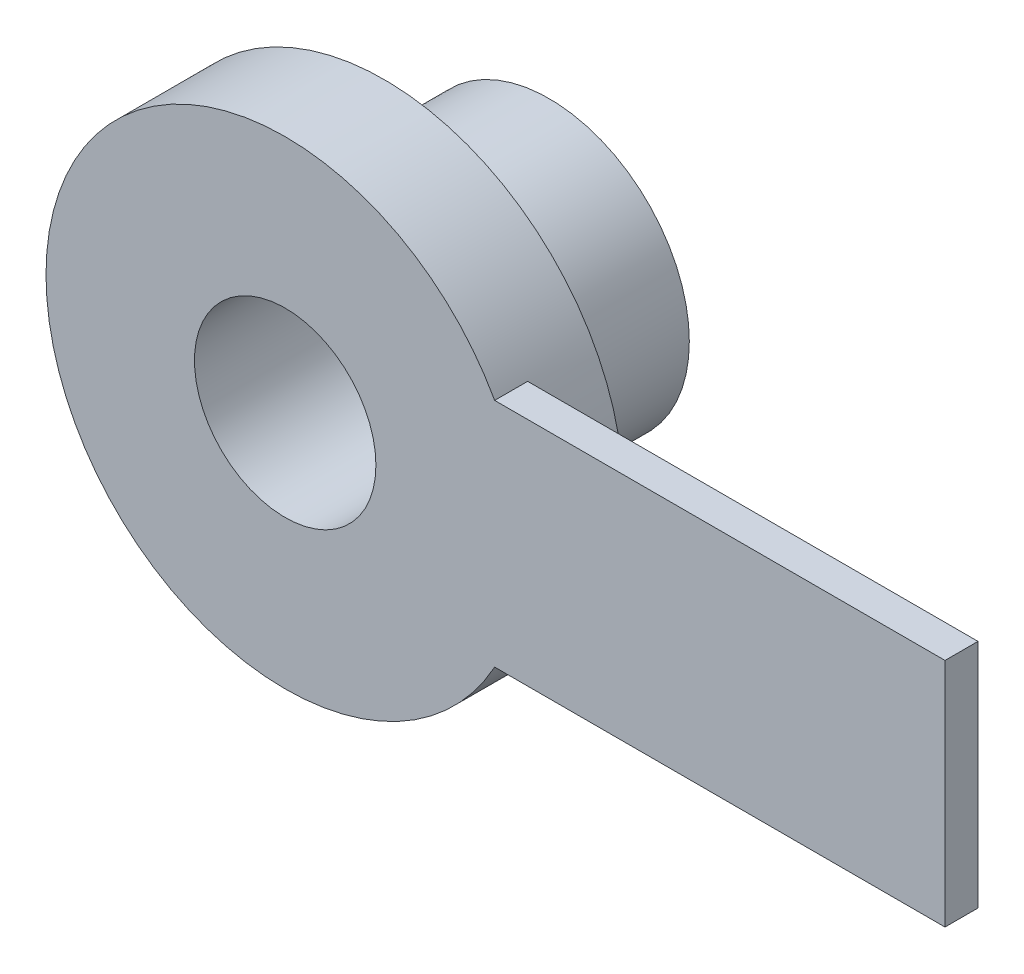
ISO-10303-21;
HEADER;
FILE_DESCRIPTION(('STEP AP214'),'2;1');
FILE_NAME('part.step','',(''),(''),'','','');
FILE_SCHEMA(('AUTOMOTIVE_DESIGN { 1 0 10303 214 1 1 1 1 }'));
ENDSEC;
DATA;
#1=APPLICATION_CONTEXT('core data for automotive mechanical design processes');
#2=APPLICATION_PROTOCOL_DEFINITION('international standard','automotive_design',2000,#1);
#3=PRODUCT_CONTEXT('',#1,'mechanical');
#4=PRODUCT('Part','Part','',(#3));
#5=PRODUCT_RELATED_PRODUCT_CATEGORY('part','',(#4));
#6=PRODUCT_DEFINITION_FORMATION('','',#4);
#7=PRODUCT_DEFINITION_CONTEXT('part definition',#1,'design');
#8=PRODUCT_DEFINITION('design','',#6,#7);
#9=PRODUCT_DEFINITION_SHAPE('','',#8);
#10=(LENGTH_UNIT() NAMED_UNIT(*) SI_UNIT(.MILLI.,.METRE.));
#11=(NAMED_UNIT(*) PLANE_ANGLE_UNIT() SI_UNIT($,.RADIAN.));
#12=(NAMED_UNIT(*) SI_UNIT($,.STERADIAN.) SOLID_ANGLE_UNIT());
#13=UNCERTAINTY_MEASURE_WITH_UNIT(LENGTH_MEASURE(1.E-05),#10,'distance_accuracy_value','');
#14=(GEOMETRIC_REPRESENTATION_CONTEXT(3) GLOBAL_UNCERTAINTY_ASSIGNED_CONTEXT((#13)) GLOBAL_UNIT_ASSIGNED_CONTEXT((#10,
#11,#12)) REPRESENTATION_CONTEXT('',''));
#15=CARTESIAN_POINT('',(0.,0.,0.));
#16=DIRECTION('',(0.,0.,1.));
#17=DIRECTION('',(1.,0.,0.));
#18=AXIS2_PLACEMENT_3D('',#15,#16,#17);
#19=CARTESIAN_POINT('',(0.,0.,0.));
#20=DIRECTION('',(0.,0.,-1.));
#21=DIRECTION('',(-1.,0.,0.));
#22=AXIS2_PLACEMENT_3D('',#19,#20,#21);
#23=PLANE('',#22);
#24=CARTESIAN_POINT('',(0.,0.,0.));
#25=DIRECTION('',(0.,0.,-1.));
#26=DIRECTION('',(-1.,0.,0.));
#27=AXIS2_PLACEMENT_3D('',#24,#25,#26);
#28=CIRCLE('',#27,7.25);
#29=CARTESIAN_POINT('',(-7.25,0.,0.));
#30=VERTEX_POINT('',#29);
#31=EDGE_CURVE('E43',#30,#30,#28,.T.);
#32=ORIENTED_EDGE('',*,*,#31,.T.);
#33=EDGE_LOOP('',(#32));
#34=FACE_BOUND('',#33,.T.);
#35=CARTESIAN_POINT('',(0.,0.,0.));
#36=DIRECTION('',(0.,0.,-1.));
#37=DIRECTION('',(-1.,0.,0.));
#38=AXIS2_PLACEMENT_3D('',#35,#36,#37);
#39=CIRCLE('',#38,4.25);
#40=CARTESIAN_POINT('',(-4.25,0.,0.));
#41=VERTEX_POINT('',#40);
#42=EDGE_CURVE('E111',#41,#41,#39,.T.);
#43=ORIENTED_EDGE('',*,*,#42,.F.);
#44=EDGE_LOOP('',(#43));
#45=FACE_BOUND('',#44,.T.);
#46=ADVANCED_FACE('F35',(#34,#45),#23,.T.);
#47=CARTESIAN_POINT('',(0.,0.,3.));
#48=DIRECTION('',(0.,0.,-1.));
#49=DIRECTION('',(-1.,0.,0.));
#50=AXIS2_PLACEMENT_3D('',#47,#48,#49);
#51=CYLINDRICAL_SURFACE('',#50,7.25);
#52=DIRECTION('',(0.,0.,-1.));
#53=VECTOR('',#52,1.);
#54=CARTESIAN_POINT('',(6.34921254960015,3.5,3.));
#55=LINE('',#54,#53);
#56=CARTESIAN_POINT('',(6.34921254960015,3.5,3.));
#57=VERTEX_POINT('',#56);
#58=CARTESIAN_POINT('',(6.34921254959873,3.50000000000256,2.));
#59=VERTEX_POINT('',#58);
#60=EDGE_CURVE('E49',#57,#59,#55,.T.);
#61=ORIENTED_EDGE('',*,*,#60,.T.);
#62=CARTESIAN_POINT('',(0.,0.,2.));
#63=DIRECTION('',(0.,0.,-1.));
#64=DIRECTION('',(-1.,0.,0.));
#65=AXIS2_PLACEMENT_3D('',#62,#63,#64);
#66=CIRCLE('',#65,7.25);
#67=CARTESIAN_POINT('',(6.34921254960015,-3.5,2.));
#68=VERTEX_POINT('',#67);
#69=EDGE_CURVE('E53',#59,#68,#66,.T.);
#70=ORIENTED_EDGE('',*,*,#69,.T.);
#71=DIRECTION('',(0.,0.,-1.));
#72=VECTOR('',#71,1.);
#73=CARTESIAN_POINT('',(6.34921254960015,-3.5,3.));
#74=LINE('',#73,#72);
#75=CARTESIAN_POINT('',(6.34921254959409,-3.5,3.));
#76=VERTEX_POINT('',#75);
#77=EDGE_CURVE('E79',#68,#76,#74,.F.);
#78=ORIENTED_EDGE('',*,*,#77,.T.);
#79=CARTESIAN_POINT('',(0.,0.,3.));
#80=DIRECTION('',(0.,0.,-1.));
#81=DIRECTION('',(-1.,0.,0.));
#82=AXIS2_PLACEMENT_3D('',#79,#80,#81);
#83=CIRCLE('',#82,7.25);
#84=EDGE_CURVE('E11',#76,#57,#83,.T.);
#85=ORIENTED_EDGE('',*,*,#84,.T.);
#86=EDGE_LOOP('',(#61,#70,#78,#85));
#87=FACE_BOUND('',#86,.T.);
#88=ORIENTED_EDGE('',*,*,#31,.F.);
#89=EDGE_LOOP('',(#88));
#90=FACE_BOUND('',#89,.T.);
#91=ADVANCED_FACE('F37',(#87,#90),#51,.T.);
#92=CARTESIAN_POINT('',(7.25,0.,3.));
#93=DIRECTION('',(0.,0.,1.));
#94=DIRECTION('',(1.,0.,0.));
#95=AXIS2_PLACEMENT_3D('',#92,#93,#94);
#96=PLANE('',#95);
#97=CARTESIAN_POINT('',(0.,0.,3.));
#98=DIRECTION('',(0.,0.,1.));
#99=DIRECTION('',(1.,0.,0.));
#100=AXIS2_PLACEMENT_3D('',#97,#98,#99);
#101=CIRCLE('',#100,2.74999999999999);
#102=CARTESIAN_POINT('',(2.74999999999999,0.,3.));
#103=VERTEX_POINT('',#102);
#104=EDGE_CURVE('E167',#103,#103,#101,.T.);
#105=ORIENTED_EDGE('',*,*,#104,.F.);
#106=EDGE_LOOP('',(#105));
#107=FACE_BOUND('',#106,.T.);
#108=ORIENTED_EDGE('',*,*,#84,.F.);
#109=DIRECTION('',(1.,0.,0.));
#110=VECTOR('',#109,1.);
#111=CARTESIAN_POINT('',(-500000.,-3.5,3.));
#112=LINE('',#111,#110);
#113=CARTESIAN_POINT('',(20.,-3.5,3.));
#114=VERTEX_POINT('',#113);
#115=EDGE_CURVE('E76',#76,#114,#112,.T.);
#116=ORIENTED_EDGE('',*,*,#115,.T.);
#117=DIRECTION('',(0.,-1.,0.));
#118=VECTOR('',#117,1.);
#119=CARTESIAN_POINT('',(20.,3.5,3.));
#120=LINE('',#119,#118);
#121=CARTESIAN_POINT('',(20.,3.5,3.));
#122=VERTEX_POINT('',#121);
#123=EDGE_CURVE('E107',#122,#114,#120,.T.);
#124=ORIENTED_EDGE('',*,*,#123,.F.);
#125=DIRECTION('',(1.,0.,0.));
#126=VECTOR('',#125,1.);
#127=CARTESIAN_POINT('',(-500000.,3.5,3.));
#128=LINE('',#127,#126);
#129=EDGE_CURVE('E78',#57,#122,#128,.T.);
#130=ORIENTED_EDGE('',*,*,#129,.F.);
#131=EDGE_LOOP('',(#108,#116,#124,#130));
#132=FACE_BOUND('',#131,.T.);
#133=ADVANCED_FACE('F73',(#107,#132),#96,.T.);
#134=CARTESIAN_POINT('',(-500000.,3.5,2.));
#135=DIRECTION('',(0.,1.,0.));
#136=DIRECTION('',(0.,0.,1.));
#137=AXIS2_PLACEMENT_3D('',#134,#135,#136);
#138=PLANE('',#137);
#139=ORIENTED_EDGE('',*,*,#60,.F.);
#140=ORIENTED_EDGE('',*,*,#129,.T.);
#141=DIRECTION('',(0.,0.,1.));
#142=VECTOR('',#141,1.);
#143=CARTESIAN_POINT('',(20.,3.5,2.));
#144=LINE('',#143,#142);
#145=CARTESIAN_POINT('',(20.,3.5,2.));
#146=VERTEX_POINT('',#145);
#147=EDGE_CURVE('E102',#146,#122,#144,.T.);
#148=ORIENTED_EDGE('',*,*,#147,.F.);
#149=DIRECTION('',(1.,0.,0.));
#150=VECTOR('',#149,1.);
#151=CARTESIAN_POINT('',(-500000.,3.5,2.));
#152=LINE('',#151,#150);
#153=EDGE_CURVE('E92',#59,#146,#152,.T.);
#154=ORIENTED_EDGE('',*,*,#153,.F.);
#155=EDGE_LOOP('',(#139,#140,#148,#154));
#156=FACE_BOUND('',#155,.T.);
#157=ADVANCED_FACE('F119',(#156),#138,.T.);
#158=CARTESIAN_POINT('',(20.,0.,0.));
#159=DIRECTION('',(1.,0.,0.));
#160=DIRECTION('',(0.,0.,-1.));
#161=AXIS2_PLACEMENT_3D('',#158,#159,#160);
#162=PLANE('',#161);
#163=DIRECTION('',(0.,1.,0.));
#164=VECTOR('',#163,1.);
#165=CARTESIAN_POINT('',(20.,-3.5,2.));
#166=LINE('',#165,#164);
#167=CARTESIAN_POINT('',(20.,-3.5,2.));
#168=VERTEX_POINT('',#167);
#169=EDGE_CURVE('E98',#168,#146,#166,.T.);
#170=ORIENTED_EDGE('',*,*,#169,.T.);
#171=ORIENTED_EDGE('',*,*,#147,.T.);
#172=ORIENTED_EDGE('',*,*,#123,.T.);
#173=DIRECTION('',(0.,0.,-1.));
#174=VECTOR('',#173,1.);
#175=CARTESIAN_POINT('',(20.,-3.5,3.));
#176=LINE('',#175,#174);
#177=EDGE_CURVE('E87',#114,#168,#176,.T.);
#178=ORIENTED_EDGE('',*,*,#177,.T.);
#179=EDGE_LOOP('',(#170,#171,#172,#178));
#180=FACE_BOUND('',#179,.T.);
#181=ADVANCED_FACE('F120',(#180),#162,.T.);
#182=CARTESIAN_POINT('',(-500000.,-3.5,2.));
#183=DIRECTION('',(0.,0.,-1.));
#184=DIRECTION('',(-1.,0.,0.));
#185=AXIS2_PLACEMENT_3D('',#182,#183,#184);
#186=PLANE('',#185);
#187=ORIENTED_EDGE('',*,*,#69,.F.);
#188=ORIENTED_EDGE('',*,*,#153,.T.);
#189=ORIENTED_EDGE('',*,*,#169,.F.);
#190=DIRECTION('',(1.,0.,0.));
#191=VECTOR('',#190,1.);
#192=CARTESIAN_POINT('',(-500000.,-3.5,2.));
#193=LINE('',#192,#191);
#194=EDGE_CURVE('E89',#68,#168,#193,.T.);
#195=ORIENTED_EDGE('',*,*,#194,.F.);
#196=EDGE_LOOP('',(#187,#188,#189,#195));
#197=FACE_BOUND('',#196,.T.);
#198=ADVANCED_FACE('F117',(#197),#186,.T.);
#199=CARTESIAN_POINT('',(-500000.,-3.5,3.));
#200=DIRECTION('',(0.,-1.,0.));
#201=DIRECTION('',(0.,0.,-1.));
#202=AXIS2_PLACEMENT_3D('',#199,#200,#201);
#203=PLANE('',#202);
#204=ORIENTED_EDGE('',*,*,#77,.F.);
#205=ORIENTED_EDGE('',*,*,#194,.T.);
#206=ORIENTED_EDGE('',*,*,#177,.F.);
#207=ORIENTED_EDGE('',*,*,#115,.F.);
#208=EDGE_LOOP('',(#204,#205,#206,#207));
#209=FACE_BOUND('',#208,.T.);
#210=ADVANCED_FACE('F85',(#209),#203,.T.);
#211=CARTESIAN_POINT('',(0.,0.,-5.));
#212=DIRECTION('',(0.,0.,1.));
#213=DIRECTION('',(1.,0.,0.));
#214=AXIS2_PLACEMENT_3D('',#211,#212,#213);
#215=CYLINDRICAL_SURFACE('',#214,4.25);
#216=CARTESIAN_POINT('',(0.,0.,-5.));
#217=DIRECTION('',(0.,0.,-1.));
#218=DIRECTION('',(-1.,0.,0.));
#219=AXIS2_PLACEMENT_3D('',#216,#217,#218);
#220=CIRCLE('',#219,4.25);
#221=CARTESIAN_POINT('',(-4.25,0.,-5.));
#222=VERTEX_POINT('',#221);
#223=EDGE_CURVE('E83',#222,#222,#220,.T.);
#224=ORIENTED_EDGE('',*,*,#223,.F.);
#225=EDGE_LOOP('',(#224));
#226=FACE_BOUND('',#225,.T.);
#227=ORIENTED_EDGE('',*,*,#42,.T.);
#228=EDGE_LOOP('',(#227));
#229=FACE_BOUND('',#228,.T.);
#230=ADVANCED_FACE('F129',(#226,#229),#215,.T.);
#231=CARTESIAN_POINT('',(0.,0.,-5.));
#232=DIRECTION('',(0.,0.,-1.));
#233=DIRECTION('',(-1.,0.,0.));
#234=AXIS2_PLACEMENT_3D('',#231,#232,#233);
#235=PLANE('',#234);
#236=CARTESIAN_POINT('',(0.,0.,-5.00000000000001));
#237=DIRECTION('',(0.,0.,1.));
#238=DIRECTION('',(1.,0.,0.));
#239=AXIS2_PLACEMENT_3D('',#236,#237,#238);
#240=CIRCLE('',#239,2.74999999999999);
#241=CARTESIAN_POINT('',(2.74999999999999,0.,-5.00000000000001));
#242=VERTEX_POINT('',#241);
#243=EDGE_CURVE('E165',#242,#242,#240,.T.);
#244=ORIENTED_EDGE('',*,*,#243,.T.);
#245=EDGE_LOOP('',(#244));
#246=FACE_BOUND('',#245,.T.);
#247=ORIENTED_EDGE('',*,*,#223,.T.);
#248=EDGE_LOOP('',(#247));
#249=FACE_BOUND('',#248,.T.);
#250=ADVANCED_FACE('F147',(#246,#249),#235,.T.);
#251=CARTESIAN_POINT('',(0.,0.,3.));
#252=DIRECTION('',(0.,0.,1.));
#253=DIRECTION('',(1.,0.,0.));
#254=AXIS2_PLACEMENT_3D('',#251,#252,#253);
#255=CYLINDRICAL_SURFACE('',#254,2.74999999999999);
#256=ORIENTED_EDGE('',*,*,#243,.F.);
#257=EDGE_LOOP('',(#256));
#258=FACE_BOUND('',#257,.T.);
#259=ORIENTED_EDGE('',*,*,#104,.T.);
#260=EDGE_LOOP('',(#259));
#261=FACE_BOUND('',#260,.T.);
#262=ADVANCED_FACE('F152',(#258,#261),#255,.F.);
#263=CLOSED_SHELL('',(#46,#91,#133,#157,#181,#198,#210,#230,#250,#262));
#264=MANIFOLD_SOLID_BREP('B2',#263);
#265=ADVANCED_BREP_SHAPE_REPRESENTATION('',(#18,#264),#14);
#266=SHAPE_DEFINITION_REPRESENTATION(#9,#265);
ENDSEC;
END-ISO-10303-21;
